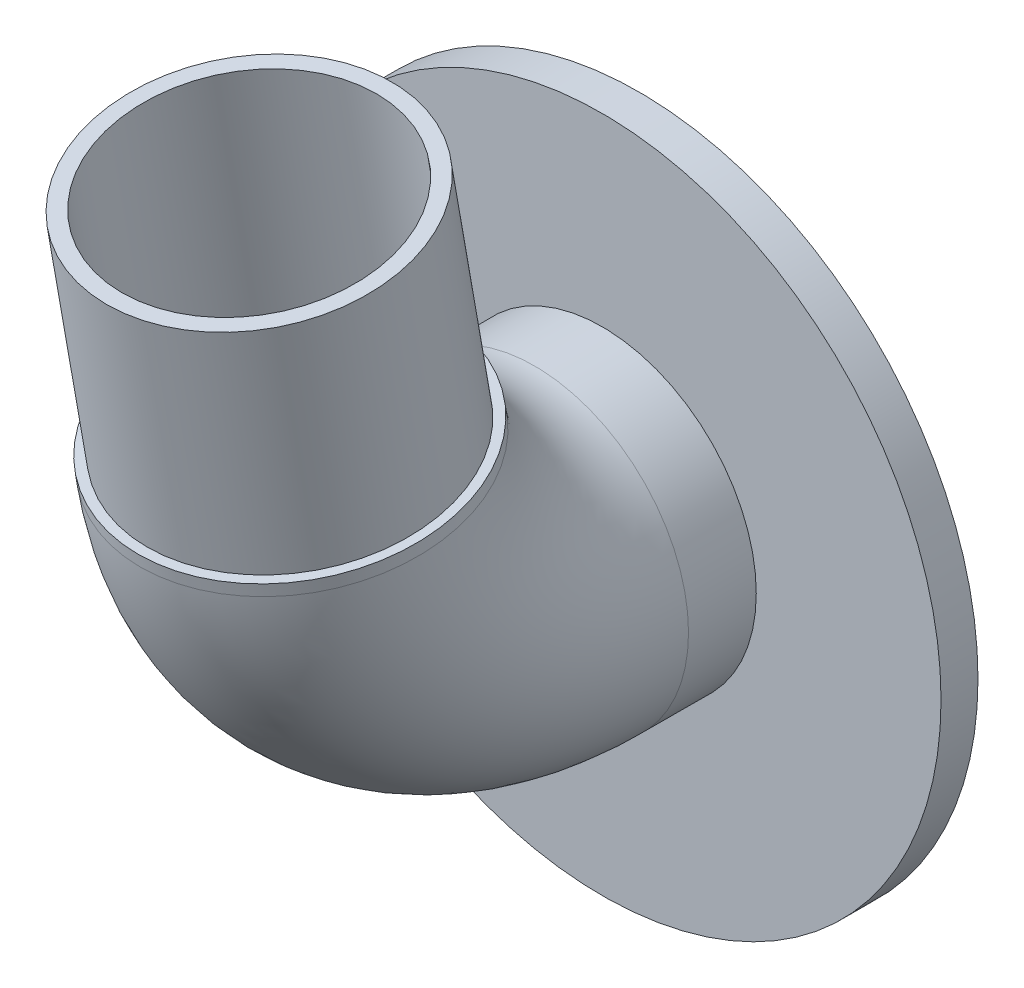
ISO-10303-21;
HEADER;
FILE_DESCRIPTION(('STEP AP214'),'2;1');
FILE_NAME('part.step','',(''),(''),'','','');
FILE_SCHEMA(('AUTOMOTIVE_DESIGN { 1 0 10303 214 1 1 1 1 }'));
ENDSEC;
DATA;
#1=APPLICATION_CONTEXT('core data for automotive mechanical design processes');
#2=APPLICATION_PROTOCOL_DEFINITION('international standard','automotive_design',2000,#1);
#3=PRODUCT_CONTEXT('',#1,'mechanical');
#4=PRODUCT('Part','Part','',(#3));
#5=PRODUCT_RELATED_PRODUCT_CATEGORY('part','',(#4));
#6=PRODUCT_DEFINITION_FORMATION('','',#4);
#7=PRODUCT_DEFINITION_CONTEXT('part definition',#1,'design');
#8=PRODUCT_DEFINITION('design','',#6,#7);
#9=PRODUCT_DEFINITION_SHAPE('','',#8);
#10=(LENGTH_UNIT() NAMED_UNIT(*) SI_UNIT(.MILLI.,.METRE.));
#11=(NAMED_UNIT(*) PLANE_ANGLE_UNIT() SI_UNIT($,.RADIAN.));
#12=(NAMED_UNIT(*) SI_UNIT($,.STERADIAN.) SOLID_ANGLE_UNIT());
#13=UNCERTAINTY_MEASURE_WITH_UNIT(LENGTH_MEASURE(1.E-05),#10,'distance_accuracy_value','');
#14=(GEOMETRIC_REPRESENTATION_CONTEXT(3) GLOBAL_UNCERTAINTY_ASSIGNED_CONTEXT((#13)) GLOBAL_UNIT_ASSIGNED_CONTEXT((#10,
#11,#12)) REPRESENTATION_CONTEXT('',''));
#15=CARTESIAN_POINT('',(0.,0.,0.));
#16=DIRECTION('',(0.,0.,1.));
#17=DIRECTION('',(1.,0.,0.));
#18=AXIS2_PLACEMENT_3D('',#15,#16,#17);
#19=CARTESIAN_POINT('',(0.,33.0540728933229,56.3923101204883));
#20=DIRECTION('',(0.,0.984807753012209,0.173648177666927));
#21=DIRECTION('',(0.,-0.173648177666927,0.984807753012209));
#22=AXIS2_PLACEMENT_3D('',#19,#20,#21);
#23=CYLINDRICAL_SURFACE('',#22,25.);
#24=CARTESIAN_POINT('',(0.,33.0540728933229,56.3923101204884));
#25=DIRECTION('',(0.,0.984807753012208,0.173648177666928));
#26=DIRECTION('',(1.,0.,0.));
#27=AXIS2_PLACEMENT_3D('',#24,#25,#26);
#28=CIRCLE('',#27,25.);
#29=CARTESIAN_POINT('',(0.,28.7128684516497,81.0125039457936));
#30=VERTEX_POINT('',#29);
#31=EDGE_CURVE('E50',#30,#30,#28,.T.);
#32=ORIENTED_EDGE('',*,*,#31,.T.);
#33=EDGE_LOOP('',(#32));
#34=FACE_BOUND('',#33,.T.);
#35=CARTESIAN_POINT('',(0.,35.0236883993473,56.7396064758222));
#36=DIRECTION('',(0.,0.984807753012209,0.173648177666927));
#37=DIRECTION('',(0.,-0.173648177666927,0.984807753012209));
#38=AXIS2_PLACEMENT_3D('',#35,#36,#37);
#39=CIRCLE('',#38,25.);
#40=CARTESIAN_POINT('',(0.,30.6824839576742,81.3598003011274));
#41=VERTEX_POINT('',#40);
#42=EDGE_CURVE('E57',#41,#41,#39,.T.);
#43=ORIENTED_EDGE('',*,*,#42,.F.);
#44=EDGE_LOOP('',(#43));
#45=FACE_BOUND('',#44,.T.);
#46=ADVANCED_FACE('F31',(#34,#45),#23,.T.);
#47=CARTESIAN_POINT('',(0.,72.4463830138113,63.3382372271654));
#48=DIRECTION('',(0.,0.984807753012209,0.173648177666927));
#49=DIRECTION('',(1.,0.,0.));
#50=AXIS2_PLACEMENT_3D('',#47,#48,#49);
#51=PLANE('',#50);
#52=CARTESIAN_POINT('',(0.,72.4463830138113,63.3382372271654));
#53=DIRECTION('',(0.,0.984807753012209,0.173648177666927));
#54=DIRECTION('',(1.,0.,0.));
#55=AXIS2_PLACEMENT_3D('',#52,#53,#54);
#56=CIRCLE('',#55,21.);
#57=CARTESIAN_POINT('',(21.,72.4463830138113,63.3382372271654));
#58=VERTEX_POINT('',#57);
#59=EDGE_CURVE('E49',#58,#58,#56,.F.);
#60=ORIENTED_EDGE('',*,*,#59,.T.);
#61=EDGE_LOOP('',(#60));
#62=FACE_BOUND('',#61,.T.);
#63=CARTESIAN_POINT('',(0.,72.4463830138113,63.3382372271654));
#64=DIRECTION('',(0.,0.984807753012209,0.173648177666927));
#65=DIRECTION('',(0.,-0.173648177666927,0.984807753012209));
#66=AXIS2_PLACEMENT_3D('',#63,#64,#65);
#67=CIRCLE('',#66,23.5);
#68=CARTESIAN_POINT('',(0.,68.3656508386385,86.4812194229523));
#69=VERTEX_POINT('',#68);
#70=EDGE_CURVE('E68',#69,#69,#67,.T.);
#71=ORIENTED_EDGE('',*,*,#70,.T.);
#72=EDGE_LOOP('',(#71));
#73=FACE_BOUND('',#72,.T.);
#74=ADVANCED_FACE('F86',(#62,#73),#51,.T.);
#75=CARTESIAN_POINT('',(0.,0.,6.));
#76=DIRECTION('',(0.,0.,1.));
#77=DIRECTION('',(1.,0.,0.));
#78=AXIS2_PLACEMENT_3D('',#75,#76,#77);
#79=PLANE('',#78);
#80=CARTESIAN_POINT('',(0.,0.,6.));
#81=DIRECTION('',(0.,0.,1.));
#82=DIRECTION('',(1.,0.,0.));
#83=AXIS2_PLACEMENT_3D('',#80,#81,#82);
#84=CIRCLE('',#83,55.);
#85=CARTESIAN_POINT('',(55.,0.,6.));
#86=VERTEX_POINT('',#85);
#87=EDGE_CURVE('E10',#86,#86,#84,.T.);
#88=ORIENTED_EDGE('',*,*,#87,.T.);
#89=EDGE_LOOP('',(#88));
#90=FACE_BOUND('',#89,.T.);
#91=CARTESIAN_POINT('',(0.,0.,6.));
#92=DIRECTION('',(0.,0.,1.));
#93=DIRECTION('',(1.,0.,0.));
#94=AXIS2_PLACEMENT_3D('',#91,#92,#93);
#95=CIRCLE('',#94,25.);
#96=CARTESIAN_POINT('',(25.,0.,6.));
#97=VERTEX_POINT('',#96);
#98=EDGE_CURVE('E42',#97,#97,#95,.T.);
#99=ORIENTED_EDGE('',*,*,#98,.F.);
#100=EDGE_LOOP('',(#99));
#101=FACE_BOUND('',#100,.T.);
#102=ADVANCED_FACE('F92',(#90,#101),#79,.T.);
#103=CARTESIAN_POINT('',(0.,0.,0.));
#104=DIRECTION('',(0.,0.,1.));
#105=DIRECTION('',(1.,0.,0.));
#106=AXIS2_PLACEMENT_3D('',#103,#104,#105);
#107=PLANE('',#106);
#108=CARTESIAN_POINT('',(0.,0.,0.));
#109=DIRECTION('',(0.,0.,1.));
#110=DIRECTION('',(1.,0.,0.));
#111=AXIS2_PLACEMENT_3D('',#108,#109,#110);
#112=CIRCLE('',#111,55.);
#113=CARTESIAN_POINT('',(55.,0.,0.));
#114=VERTEX_POINT('',#113);
#115=EDGE_CURVE('E35',#114,#114,#112,.T.);
#116=ORIENTED_EDGE('',*,*,#115,.F.);
#117=EDGE_LOOP('',(#116));
#118=FACE_BOUND('',#117,.T.);
#119=CARTESIAN_POINT('',(0.,0.,0.));
#120=DIRECTION('',(0.,0.,1.));
#121=DIRECTION('',(1.,0.,0.));
#122=AXIS2_PLACEMENT_3D('',#119,#120,#121);
#123=CIRCLE('',#122,21.);
#124=CARTESIAN_POINT('',(21.,0.,0.));
#125=VERTEX_POINT('',#124);
#126=EDGE_CURVE('E46',#125,#125,#123,.F.);
#127=ORIENTED_EDGE('',*,*,#126,.F.);
#128=EDGE_LOOP('',(#127));
#129=FACE_BOUND('',#128,.T.);
#130=ADVANCED_FACE('F106',(#118,#129),#107,.F.);
#131=CARTESIAN_POINT('',(0.,0.,6.));
#132=DIRECTION('',(0.,0.,-1.));
#133=DIRECTION('',(-1.,0.,0.));
#134=AXIS2_PLACEMENT_3D('',#131,#132,#133);
#135=CYLINDRICAL_SURFACE('',#134,55.);
#136=ORIENTED_EDGE('',*,*,#87,.F.);
#137=EDGE_LOOP('',(#136));
#138=FACE_BOUND('',#137,.T.);
#139=ORIENTED_EDGE('',*,*,#115,.T.);
#140=EDGE_LOOP('',(#139));
#141=FACE_BOUND('',#140,.T.);
#142=ADVANCED_FACE('F33',(#138,#141),#135,.T.);
#143=CARTESIAN_POINT('',(0.,0.,-70.7106781186548));
#144=DIRECTION('',(0.,0.,1.));
#145=DIRECTION('',(1.,0.,0.));
#146=AXIS2_PLACEMENT_3D('',#143,#144,#145);
#147=CYLINDRICAL_SURFACE('',#146,25.);
#148=ORIENTED_EDGE('',*,*,#98,.T.);
#149=EDGE_LOOP('',(#148));
#150=FACE_BOUND('',#149,.T.);
#151=CARTESIAN_POINT('',(0.,0.,17.));
#152=DIRECTION('',(0.,0.,1.));
#153=DIRECTION('',(1.,0.,0.));
#154=AXIS2_PLACEMENT_3D('',#151,#152,#153);
#155=CIRCLE('',#154,25.);
#156=CARTESIAN_POINT('',(0.,-25.,17.));
#157=VERTEX_POINT('',#156);
#158=EDGE_CURVE('E54',#157,#157,#155,.T.);
#159=ORIENTED_EDGE('',*,*,#158,.F.);
#160=EDGE_LOOP('',(#159));
#161=FACE_BOUND('',#160,.T.);
#162=ADVANCED_FACE('F100',(#150,#161),#147,.T.);
#163=CARTESIAN_POINT('',(0.,0.,-70.7106781186548));
#164=DIRECTION('',(0.,0.,1.));
#165=DIRECTION('',(1.,0.,0.));
#166=AXIS2_PLACEMENT_3D('',#163,#164,#165);
#167=CYLINDRICAL_SURFACE('',#166,21.);
#168=ORIENTED_EDGE('',*,*,#126,.T.);
#169=EDGE_LOOP('',(#168));
#170=FACE_BOUND('',#169,.T.);
#171=CARTESIAN_POINT('',(0.,0.,17.));
#172=DIRECTION('',(0.,0.,1.));
#173=DIRECTION('',(1.,0.,0.));
#174=AXIS2_PLACEMENT_3D('',#171,#172,#173);
#175=CIRCLE('',#174,21.);
#176=CARTESIAN_POINT('',(0.,-21.,17.));
#177=VERTEX_POINT('',#176);
#178=EDGE_CURVE('E53',#177,#177,#175,.F.);
#179=ORIENTED_EDGE('',*,*,#178,.F.);
#180=EDGE_LOOP('',(#179));
#181=FACE_BOUND('',#180,.T.);
#182=ADVANCED_FACE('F97',(#170,#181),#167,.F.);
#183=CARTESIAN_POINT('',(0.,40.,17.));
#184=DIRECTION('',(-1.,0.,0.));
#185=DIRECTION('',(0.,0.,1.));
#186=AXIS2_PLACEMENT_3D('',#183,#184,#185);
#187=TOROIDAL_SURFACE('',#186,40.,25.);
#188=CARTESIAN_POINT('',(0.,40.,17.));
#189=DIRECTION('',(-1.,0.,0.));
#190=DIRECTION('',(0.,0.,1.));
#191=AXIS2_PLACEMENT_3D('',#188,#189,#190);
#192=CIRCLE('',#191,65.);
#193=EDGE_CURVE('',#157,#30,#192,.T.);
#194=ORIENTED_EDGE('',*,*,#158,.T.);
#195=ORIENTED_EDGE('',*,*,#31,.F.);
#196=ORIENTED_EDGE('',*,*,#193,.T.);
#197=ORIENTED_EDGE('',*,*,#193,.F.);
#198=EDGE_LOOP('',(#194,#196,#195,#197));
#199=FACE_BOUND('',#198,.T.);
#200=ADVANCED_FACE('F82',(#199),#187,.T.);
#201=CARTESIAN_POINT('',(0.,40.,17.));
#202=DIRECTION('',(-1.,0.,0.));
#203=DIRECTION('',(0.,0.,1.));
#204=AXIS2_PLACEMENT_3D('',#201,#202,#203);
#205=TOROIDAL_SURFACE('',#204,40.,21.);
#206=CARTESIAN_POINT('',(0.,33.0540728933229,56.3923101204884));
#207=DIRECTION('',(0.,0.984807753012208,0.173648177666928));
#208=DIRECTION('',(1.,0.,0.));
#209=AXIS2_PLACEMENT_3D('',#206,#207,#208);
#210=CIRCLE('',#209,21.);
#211=CARTESIAN_POINT('',(0.,29.4074611623174,77.0732729337447));
#212=VERTEX_POINT('',#211);
#213=EDGE_CURVE('E60',#212,#212,#210,.F.);
#214=CARTESIAN_POINT('',(0.,40.,17.));
#215=DIRECTION('',(-1.,0.,0.));
#216=DIRECTION('',(0.,0.,1.));
#217=AXIS2_PLACEMENT_3D('',#214,#215,#216);
#218=CIRCLE('',#217,61.);
#219=EDGE_CURVE('',#177,#212,#218,.T.);
#220=ORIENTED_EDGE('',*,*,#178,.T.);
#221=ORIENTED_EDGE('',*,*,#213,.F.);
#222=ORIENTED_EDGE('',*,*,#219,.T.);
#223=ORIENTED_EDGE('',*,*,#219,.F.);
#224=EDGE_LOOP('',(#220,#222,#221,#223));
#225=FACE_BOUND('',#224,.T.);
#226=ADVANCED_FACE('F119',(#225),#205,.F.);
#227=CARTESIAN_POINT('',(0.,33.0540728933229,56.3923101204883));
#228=DIRECTION('',(0.,0.984807753012209,0.173648177666927));
#229=DIRECTION('',(0.,-0.173648177666927,0.984807753012209));
#230=AXIS2_PLACEMENT_3D('',#227,#228,#229);
#231=CYLINDRICAL_SURFACE('',#230,21.);
#232=ORIENTED_EDGE('',*,*,#59,.F.);
#233=EDGE_LOOP('',(#232));
#234=FACE_BOUND('',#233,.T.);
#235=ORIENTED_EDGE('',*,*,#213,.T.);
#236=EDGE_LOOP('',(#235));
#237=FACE_BOUND('',#236,.T.);
#238=ADVANCED_FACE('F80',(#234,#237),#231,.F.);
#239=CARTESIAN_POINT('',(0.,35.0236883993473,56.7396064758222));
#240=DIRECTION('',(0.,0.984807753012209,0.173648177666927));
#241=DIRECTION('',(0.,-0.173648177666927,0.984807753012209));
#242=AXIS2_PLACEMENT_3D('',#239,#240,#241);
#243=PLANE('',#242);
#244=CARTESIAN_POINT('',(0.,35.0236883993473,56.7396064758222));
#245=DIRECTION('',(0.,0.984807753012209,0.173648177666927));
#246=DIRECTION('',(0.,-0.173648177666927,0.984807753012209));
#247=AXIS2_PLACEMENT_3D('',#244,#245,#246);
#248=CIRCLE('',#247,23.5);
#249=CARTESIAN_POINT('',(0.,30.9429562241746,79.8825886716091));
#250=VERTEX_POINT('',#249);
#251=EDGE_CURVE('E67',#250,#250,#248,.T.);
#252=ORIENTED_EDGE('',*,*,#251,.F.);
#253=EDGE_LOOP('',(#252));
#254=FACE_BOUND('',#253,.T.);
#255=ORIENTED_EDGE('',*,*,#42,.T.);
#256=EDGE_LOOP('',(#255));
#257=FACE_BOUND('',#256,.T.);
#258=ADVANCED_FACE('F77',(#254,#257),#243,.T.);
#259=CARTESIAN_POINT('',(0.,35.0236883993473,56.7396064758222));
#260=DIRECTION('',(0.,0.984807753012209,0.173648177666927));
#261=DIRECTION('',(0.,-0.173648177666927,0.984807753012209));
#262=AXIS2_PLACEMENT_3D('',#259,#260,#261);
#263=CYLINDRICAL_SURFACE('',#262,23.5);
#264=ORIENTED_EDGE('',*,*,#251,.T.);
#265=EDGE_LOOP('',(#264));
#266=FACE_BOUND('',#265,.T.);
#267=ORIENTED_EDGE('',*,*,#70,.F.);
#268=EDGE_LOOP('',(#267));
#269=FACE_BOUND('',#268,.T.);
#270=ADVANCED_FACE('F74',(#266,#269),#263,.T.);
#271=CLOSED_SHELL('',(#46,#74,#102,#130,#142,#162,#182,#200,#226,#238,#258,#270));
#272=MANIFOLD_SOLID_BREP('B2',#271);
#273=ADVANCED_BREP_SHAPE_REPRESENTATION('',(#18,#272),#14);
#274=SHAPE_DEFINITION_REPRESENTATION(#9,#273);
ENDSEC;
END-ISO-10303-21;
